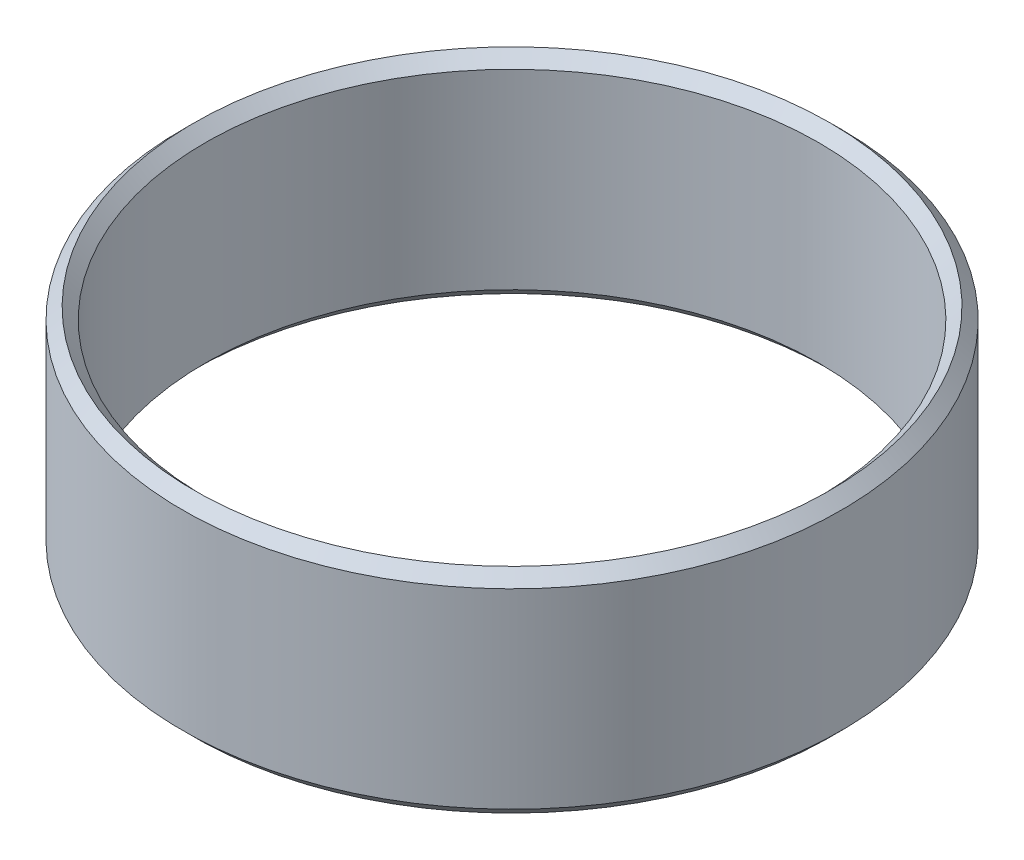
ISO-10303-21;
HEADER;
FILE_DESCRIPTION(('STEP AP214'),'2;1');
FILE_NAME('part.step','',(''),(''),'','','');
FILE_SCHEMA(('AUTOMOTIVE_DESIGN { 1 0 10303 214 1 1 1 1 }'));
ENDSEC;
DATA;
#1=APPLICATION_CONTEXT('core data for automotive mechanical design processes');
#2=APPLICATION_PROTOCOL_DEFINITION('international standard','automotive_design',2000,#1);
#3=PRODUCT_CONTEXT('',#1,'mechanical');
#4=PRODUCT('Part','Part','',(#3));
#5=PRODUCT_RELATED_PRODUCT_CATEGORY('part','',(#4));
#6=PRODUCT_DEFINITION_FORMATION('','',#4);
#7=PRODUCT_DEFINITION_CONTEXT('part definition',#1,'design');
#8=PRODUCT_DEFINITION('design','',#6,#7);
#9=PRODUCT_DEFINITION_SHAPE('','',#8);
#10=(LENGTH_UNIT() NAMED_UNIT(*) SI_UNIT(.MILLI.,.METRE.));
#11=(NAMED_UNIT(*) PLANE_ANGLE_UNIT() SI_UNIT($,.RADIAN.));
#12=(NAMED_UNIT(*) SI_UNIT($,.STERADIAN.) SOLID_ANGLE_UNIT());
#13=UNCERTAINTY_MEASURE_WITH_UNIT(LENGTH_MEASURE(1.E-05),#10,'distance_accuracy_value','');
#14=(GEOMETRIC_REPRESENTATION_CONTEXT(3) GLOBAL_UNCERTAINTY_ASSIGNED_CONTEXT((#13)) GLOBAL_UNIT_ASSIGNED_CONTEXT((#10,
#11,#12)) REPRESENTATION_CONTEXT('',''));
#15=CARTESIAN_POINT('',(0.,0.,0.));
#16=DIRECTION('',(0.,0.,1.));
#17=DIRECTION('',(1.,0.,0.));
#18=AXIS2_PLACEMENT_3D('',#15,#16,#17);
#19=CARTESIAN_POINT('',(0.,-35.4999999999996,0.));
#20=DIRECTION('',(0.,-1.,0.));
#21=DIRECTION('',(0.,0.,-1.));
#22=AXIS2_PLACEMENT_3D('',#19,#20,#21);
#23=CONICAL_SURFACE('',#22,53.8359124960528,0.785398163397448);
#24=CARTESIAN_POINT('',(0.,-37.4999999999996,0.));
#25=DIRECTION('',(0.,-1.,0.));
#26=DIRECTION('',(0.,0.,-1.));
#27=AXIS2_PLACEMENT_3D('',#24,#25,#26);
#28=CIRCLE('',#27,55.8359124960528);
#29=CARTESIAN_POINT('',(0.,-37.4999999999996,-55.8359124960528));
#30=VERTEX_POINT('',#29);
#31=EDGE_CURVE('E10',#30,#30,#28,.T.);
#32=ORIENTED_EDGE('',*,*,#31,.T.);
#33=EDGE_LOOP('',(#32));
#34=FACE_BOUND('',#33,.T.);
#35=CARTESIAN_POINT('',(0.,-35.4999999999996,0.));
#36=DIRECTION('',(0.,-1.,0.));
#37=DIRECTION('',(0.,0.,-1.));
#38=AXIS2_PLACEMENT_3D('',#35,#36,#37);
#39=CIRCLE('',#38,53.8359124960528);
#40=CARTESIAN_POINT('',(0.,-35.4999999999996,-53.8359124960528));
#41=VERTEX_POINT('',#40);
#42=EDGE_CURVE('E59',#41,#41,#39,.T.);
#43=ORIENTED_EDGE('',*,*,#42,.F.);
#44=EDGE_LOOP('',(#43));
#45=FACE_BOUND('',#44,.T.);
#46=ADVANCED_FACE('F37',(#34,#45),#23,.F.);
#47=CARTESIAN_POINT('',(0.,-37.4999999999996,0.));
#48=DIRECTION('',(0.,1.,0.));
#49=DIRECTION('',(0.,0.,1.));
#50=AXIS2_PLACEMENT_3D('',#47,#48,#49);
#51=CONICAL_SURFACE('',#50,55.8359124960528,0.785398163397442);
#52=CARTESIAN_POINT('',(0.,-35.4999999999996,0.));
#53=DIRECTION('',(0.,-1.,0.));
#54=DIRECTION('',(0.,0.,-1.));
#55=AXIS2_PLACEMENT_3D('',#52,#53,#54);
#56=CIRCLE('',#55,57.8359124960527);
#57=CARTESIAN_POINT('',(0.,-35.4999999999996,-57.8359124960527));
#58=VERTEX_POINT('',#57);
#59=EDGE_CURVE('E43',#58,#58,#56,.T.);
#60=ORIENTED_EDGE('',*,*,#59,.T.);
#61=EDGE_LOOP('',(#60));
#62=FACE_BOUND('',#61,.T.);
#63=ORIENTED_EDGE('',*,*,#31,.F.);
#64=EDGE_LOOP('',(#63));
#65=FACE_BOUND('',#64,.T.);
#66=ADVANCED_FACE('F67',(#62,#65),#51,.T.);
#67=CARTESIAN_POINT('',(0.,-6.69166428035196,0.));
#68=DIRECTION('',(0.,-1.,0.));
#69=DIRECTION('',(0.,0.,-1.));
#70=AXIS2_PLACEMENT_3D('',#67,#68,#69);
#71=CYLINDRICAL_SURFACE('',#70,57.8359124960527);
#72=CARTESIAN_POINT('',(0.,-2.00000000000001,0.));
#73=DIRECTION('',(0.,-1.,0.));
#74=DIRECTION('',(0.,0.,-1.));
#75=AXIS2_PLACEMENT_3D('',#72,#73,#74);
#76=CIRCLE('',#75,57.8359124960528);
#77=CARTESIAN_POINT('',(0.,-2.00000000000001,-57.8359124960528));
#78=VERTEX_POINT('',#77);
#79=EDGE_CURVE('E47',#78,#78,#76,.T.);
#80=ORIENTED_EDGE('',*,*,#79,.T.);
#81=EDGE_LOOP('',(#80));
#82=FACE_BOUND('',#81,.T.);
#83=ORIENTED_EDGE('',*,*,#59,.F.);
#84=EDGE_LOOP('',(#83));
#85=FACE_BOUND('',#84,.T.);
#86=ADVANCED_FACE('F71',(#82,#85),#71,.T.);
#87=CARTESIAN_POINT('',(0.,-2.00000000000001,0.));
#88=DIRECTION('',(0.,-1.,0.));
#89=DIRECTION('',(0.,0.,-1.));
#90=AXIS2_PLACEMENT_3D('',#87,#88,#89);
#91=CONICAL_SURFACE('',#90,57.8359124960528,0.785398163397448);
#92=CARTESIAN_POINT('',(0.,0.,0.));
#93=DIRECTION('',(0.,-1.,0.));
#94=DIRECTION('',(0.,0.,-1.));
#95=AXIS2_PLACEMENT_3D('',#92,#93,#94);
#96=CIRCLE('',#95,55.8359124960528);
#97=CARTESIAN_POINT('',(0.,0.,-55.8359124960528));
#98=VERTEX_POINT('',#97);
#99=EDGE_CURVE('E51',#98,#98,#96,.T.);
#100=ORIENTED_EDGE('',*,*,#99,.T.);
#101=EDGE_LOOP('',(#100));
#102=FACE_BOUND('',#101,.T.);
#103=ORIENTED_EDGE('',*,*,#79,.F.);
#104=EDGE_LOOP('',(#103));
#105=FACE_BOUND('',#104,.T.);
#106=ADVANCED_FACE('F75',(#102,#105),#91,.T.);
#107=CARTESIAN_POINT('',(0.,0.,0.));
#108=DIRECTION('',(0.,1.,0.));
#109=DIRECTION('',(0.,0.,1.));
#110=AXIS2_PLACEMENT_3D('',#107,#108,#109);
#111=CONICAL_SURFACE('',#110,55.8359124960528,0.785398163397448);
#112=CARTESIAN_POINT('',(0.,-2.00000000000001,0.));
#113=DIRECTION('',(0.,-1.,0.));
#114=DIRECTION('',(0.,0.,-1.));
#115=AXIS2_PLACEMENT_3D('',#112,#113,#114);
#116=CIRCLE('',#115,53.8359124960528);
#117=CARTESIAN_POINT('',(0.,-2.00000000000001,-53.8359124960528));
#118=VERTEX_POINT('',#117);
#119=EDGE_CURVE('E56',#118,#118,#116,.T.);
#120=ORIENTED_EDGE('',*,*,#119,.T.);
#121=EDGE_LOOP('',(#120));
#122=FACE_BOUND('',#121,.T.);
#123=ORIENTED_EDGE('',*,*,#99,.F.);
#124=EDGE_LOOP('',(#123));
#125=FACE_BOUND('',#124,.T.);
#126=ADVANCED_FACE('F82',(#122,#125),#111,.F.);
#127=CARTESIAN_POINT('',(0.,-6.69166428035196,0.));
#128=DIRECTION('',(0.,-1.,0.));
#129=DIRECTION('',(0.,0.,-1.));
#130=AXIS2_PLACEMENT_3D('',#127,#128,#129);
#131=CYLINDRICAL_SURFACE('',#130,53.8359124960528);
#132=ORIENTED_EDGE('',*,*,#42,.T.);
#133=EDGE_LOOP('',(#132));
#134=FACE_BOUND('',#133,.T.);
#135=ORIENTED_EDGE('',*,*,#119,.F.);
#136=EDGE_LOOP('',(#135));
#137=FACE_BOUND('',#136,.T.);
#138=ADVANCED_FACE('F63',(#134,#137),#131,.F.);
#139=CLOSED_SHELL('',(#46,#66,#86,#106,#126,#138));
#140=MANIFOLD_SOLID_BREP('B2',#139);
#141=ADVANCED_BREP_SHAPE_REPRESENTATION('',(#18,#140),#14);
#142=SHAPE_DEFINITION_REPRESENTATION(#9,#141);
ENDSEC;
END-ISO-10303-21;
